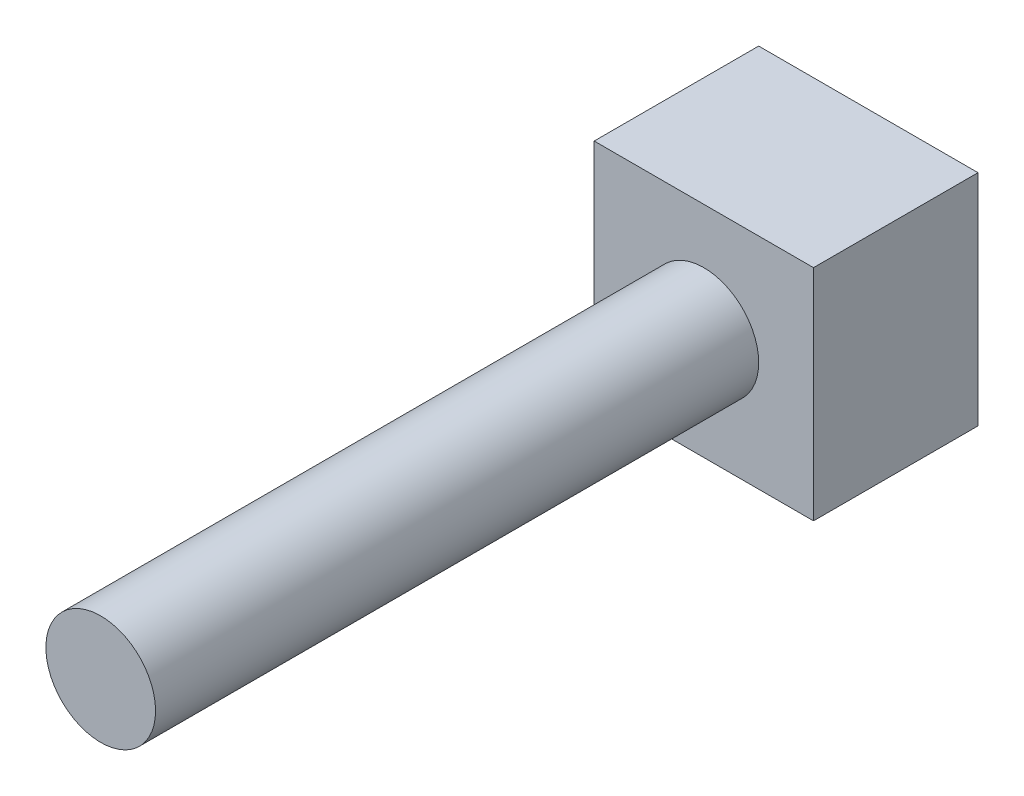
ISO-10303-21;
HEADER;
FILE_DESCRIPTION(('STEP AP214'),'2;1');
FILE_NAME('part.step','',(''),(''),'','','');
FILE_SCHEMA(('AUTOMOTIVE_DESIGN { 1 0 10303 214 1 1 1 1 }'));
ENDSEC;
DATA;
#1=APPLICATION_CONTEXT('core data for automotive mechanical design processes');
#2=APPLICATION_PROTOCOL_DEFINITION('international standard','automotive_design',2000,#1);
#3=PRODUCT_CONTEXT('',#1,'mechanical');
#4=PRODUCT('Part','Part','',(#3));
#5=PRODUCT_RELATED_PRODUCT_CATEGORY('part','',(#4));
#6=PRODUCT_DEFINITION_FORMATION('','',#4);
#7=PRODUCT_DEFINITION_CONTEXT('part definition',#1,'design');
#8=PRODUCT_DEFINITION('design','',#6,#7);
#9=PRODUCT_DEFINITION_SHAPE('','',#8);
#10=(LENGTH_UNIT() NAMED_UNIT(*) SI_UNIT(.MILLI.,.METRE.));
#11=(NAMED_UNIT(*) PLANE_ANGLE_UNIT() SI_UNIT($,.RADIAN.));
#12=(NAMED_UNIT(*) SI_UNIT($,.STERADIAN.) SOLID_ANGLE_UNIT());
#13=UNCERTAINTY_MEASURE_WITH_UNIT(LENGTH_MEASURE(1.E-05),#10,'distance_accuracy_value','');
#14=(GEOMETRIC_REPRESENTATION_CONTEXT(3) GLOBAL_UNCERTAINTY_ASSIGNED_CONTEXT((#13)) GLOBAL_UNIT_ASSIGNED_CONTEXT((#10,
#11,#12)) REPRESENTATION_CONTEXT('',''));
#15=CARTESIAN_POINT('',(0.,0.,0.));
#16=DIRECTION('',(0.,0.,1.));
#17=DIRECTION('',(1.,0.,0.));
#18=AXIS2_PLACEMENT_3D('',#15,#16,#17);
#19=CARTESIAN_POINT('',(1.,1.,1.5));
#20=DIRECTION('',(-1.,0.,0.));
#21=DIRECTION('',(0.,-1.,0.));
#22=AXIS2_PLACEMENT_3D('',#19,#20,#21);
#23=PLANE('',#22);
#24=DIRECTION('',(0.,1.,0.));
#25=VECTOR('',#24,1.);
#26=CARTESIAN_POINT('',(1.,1.,0.));
#27=LINE('',#26,#25);
#28=CARTESIAN_POINT('',(1.,-1.,0.));
#29=VERTEX_POINT('',#28);
#30=CARTESIAN_POINT('',(1.,1.,0.));
#31=VERTEX_POINT('',#30);
#32=EDGE_CURVE('E105',#29,#31,#27,.T.);
#33=ORIENTED_EDGE('',*,*,#32,.T.);
#34=DIRECTION('',(0.,0.,-1.));
#35=VECTOR('',#34,1.);
#36=CARTESIAN_POINT('',(1.,1.,1.5));
#37=LINE('',#36,#35);
#38=CARTESIAN_POINT('',(1.,1.,1.5));
#39=VERTEX_POINT('',#38);
#40=EDGE_CURVE('E42',#39,#31,#37,.T.);
#41=ORIENTED_EDGE('',*,*,#40,.F.);
#42=DIRECTION('',(0.,1.,0.));
#43=VECTOR('',#42,1.);
#44=CARTESIAN_POINT('',(1.,1.,1.5));
#45=LINE('',#44,#43);
#46=CARTESIAN_POINT('',(1.,-1.,1.5));
#47=VERTEX_POINT('',#46);
#48=EDGE_CURVE('E92',#47,#39,#45,.T.);
#49=ORIENTED_EDGE('',*,*,#48,.F.);
#50=DIRECTION('',(0.,0.,-1.));
#51=VECTOR('',#50,1.);
#52=CARTESIAN_POINT('',(1.,-1.,1.5));
#53=LINE('',#52,#51);
#54=EDGE_CURVE('E101',#47,#29,#53,.T.);
#55=ORIENTED_EDGE('',*,*,#54,.T.);
#56=EDGE_LOOP('',(#33,#41,#49,#55));
#57=FACE_BOUND('',#56,.T.);
#58=ADVANCED_FACE('F39',(#57),#23,.F.);
#59=CARTESIAN_POINT('',(-1.,1.,1.5));
#60=DIRECTION('',(0.,-1.,0.));
#61=DIRECTION('',(0.,0.,-1.));
#62=AXIS2_PLACEMENT_3D('',#59,#60,#61);
#63=PLANE('',#62);
#64=DIRECTION('',(-1.,0.,0.));
#65=VECTOR('',#64,1.);
#66=CARTESIAN_POINT('',(-1.,1.,0.));
#67=LINE('',#66,#65);
#68=CARTESIAN_POINT('',(-1.,1.,0.));
#69=VERTEX_POINT('',#68);
#70=EDGE_CURVE('E97',#31,#69,#67,.T.);
#71=ORIENTED_EDGE('',*,*,#70,.T.);
#72=DIRECTION('',(0.,0.,-1.));
#73=VECTOR('',#72,1.);
#74=CARTESIAN_POINT('',(-1.,1.,1.5));
#75=LINE('',#74,#73);
#76=CARTESIAN_POINT('',(-1.,1.,1.5));
#77=VERTEX_POINT('',#76);
#78=EDGE_CURVE('E95',#77,#69,#75,.T.);
#79=ORIENTED_EDGE('',*,*,#78,.F.);
#80=DIRECTION('',(-1.,0.,0.));
#81=VECTOR('',#80,1.);
#82=CARTESIAN_POINT('',(-1.,1.,1.5));
#83=LINE('',#82,#81);
#84=EDGE_CURVE('E87',#39,#77,#83,.T.);
#85=ORIENTED_EDGE('',*,*,#84,.F.);
#86=ORIENTED_EDGE('',*,*,#40,.T.);
#87=EDGE_LOOP('',(#71,#79,#85,#86));
#88=FACE_BOUND('',#87,.T.);
#89=ADVANCED_FACE('F96',(#88),#63,.F.);
#90=CARTESIAN_POINT('',(-1.,1.,1.5));
#91=DIRECTION('',(1.,0.,0.));
#92=DIRECTION('',(0.,1.,0.));
#93=AXIS2_PLACEMENT_3D('',#90,#91,#92);
#94=PLANE('',#93);
#95=DIRECTION('',(0.,-1.,0.));
#96=VECTOR('',#95,1.);
#97=CARTESIAN_POINT('',(-1.,1.,0.));
#98=LINE('',#97,#96);
#99=CARTESIAN_POINT('',(-1.,-1.,0.));
#100=VERTEX_POINT('',#99);
#101=EDGE_CURVE('E73',#69,#100,#98,.T.);
#102=ORIENTED_EDGE('',*,*,#101,.T.);
#103=DIRECTION('',(0.,0.,-1.));
#104=VECTOR('',#103,1.);
#105=CARTESIAN_POINT('',(-1.,-1.,1.5));
#106=LINE('',#105,#104);
#107=CARTESIAN_POINT('',(-1.,-1.,1.5));
#108=VERTEX_POINT('',#107);
#109=EDGE_CURVE('E98',#108,#100,#106,.T.);
#110=ORIENTED_EDGE('',*,*,#109,.F.);
#111=DIRECTION('',(0.,-1.,0.));
#112=VECTOR('',#111,1.);
#113=CARTESIAN_POINT('',(-1.,1.,1.5));
#114=LINE('',#113,#112);
#115=EDGE_CURVE('E90',#77,#108,#114,.T.);
#116=ORIENTED_EDGE('',*,*,#115,.F.);
#117=ORIENTED_EDGE('',*,*,#78,.T.);
#118=EDGE_LOOP('',(#102,#110,#116,#117));
#119=FACE_BOUND('',#118,.T.);
#120=ADVANCED_FACE('F99',(#119),#94,.F.);
#121=CARTESIAN_POINT('',(-1.,-1.,1.5));
#122=DIRECTION('',(0.,1.,0.));
#123=DIRECTION('',(0.,0.,1.));
#124=AXIS2_PLACEMENT_3D('',#121,#122,#123);
#125=PLANE('',#124);
#126=DIRECTION('',(1.,0.,0.));
#127=VECTOR('',#126,1.);
#128=CARTESIAN_POINT('',(-1.,-1.,0.));
#129=LINE('',#128,#127);
#130=EDGE_CURVE('E79',#100,#29,#129,.T.);
#131=ORIENTED_EDGE('',*,*,#130,.T.);
#132=ORIENTED_EDGE('',*,*,#54,.F.);
#133=DIRECTION('',(1.,0.,0.));
#134=VECTOR('',#133,1.);
#135=CARTESIAN_POINT('',(-1.,-1.,1.5));
#136=LINE('',#135,#134);
#137=EDGE_CURVE('E56',#108,#47,#136,.T.);
#138=ORIENTED_EDGE('',*,*,#137,.F.);
#139=ORIENTED_EDGE('',*,*,#109,.T.);
#140=EDGE_LOOP('',(#131,#132,#138,#139));
#141=FACE_BOUND('',#140,.T.);
#142=ADVANCED_FACE('F113',(#141),#125,.F.);
#143=CARTESIAN_POINT('',(0.,0.,1.5));
#144=DIRECTION('',(0.,0.,1.));
#145=DIRECTION('',(1.,0.,0.));
#146=AXIS2_PLACEMENT_3D('',#143,#144,#145);
#147=PLANE('',#146);
#148=CARTESIAN_POINT('',(0.,0.,1.5));
#149=DIRECTION('',(0.,0.,1.));
#150=DIRECTION('',(1.,0.,0.));
#151=AXIS2_PLACEMENT_3D('',#148,#149,#150);
#152=CIRCLE('',#151,0.5);
#153=CARTESIAN_POINT('',(0.5,0.,1.5));
#154=VERTEX_POINT('',#153);
#155=EDGE_CURVE('E11',#154,#154,#152,.T.);
#156=ORIENTED_EDGE('',*,*,#155,.F.);
#157=EDGE_LOOP('',(#156));
#158=FACE_BOUND('',#157,.T.);
#159=ORIENTED_EDGE('',*,*,#48,.T.);
#160=ORIENTED_EDGE('',*,*,#84,.T.);
#161=ORIENTED_EDGE('',*,*,#115,.T.);
#162=ORIENTED_EDGE('',*,*,#137,.T.);
#163=EDGE_LOOP('',(#159,#160,#161,#162));
#164=FACE_BOUND('',#163,.T.);
#165=ADVANCED_FACE('F88',(#158,#164),#147,.T.);
#166=CARTESIAN_POINT('',(0.,0.,0.));
#167=DIRECTION('',(0.,0.,1.));
#168=DIRECTION('',(1.,0.,0.));
#169=AXIS2_PLACEMENT_3D('',#166,#167,#168);
#170=PLANE('',#169);
#171=ORIENTED_EDGE('',*,*,#32,.F.);
#172=ORIENTED_EDGE('',*,*,#130,.F.);
#173=ORIENTED_EDGE('',*,*,#101,.F.);
#174=ORIENTED_EDGE('',*,*,#70,.F.);
#175=EDGE_LOOP('',(#171,#172,#173,#174));
#176=FACE_BOUND('',#175,.T.);
#177=ADVANCED_FACE('F116',(#176),#170,.F.);
#178=CARTESIAN_POINT('',(0.,0.,7.));
#179=DIRECTION('',(0.,0.,-1.));
#180=DIRECTION('',(-1.,0.,0.));
#181=AXIS2_PLACEMENT_3D('',#178,#179,#180);
#182=CYLINDRICAL_SURFACE('',#181,0.5);
#183=CARTESIAN_POINT('',(0.,0.,7.));
#184=DIRECTION('',(0.,0.,1.));
#185=DIRECTION('',(1.,0.,0.));
#186=AXIS2_PLACEMENT_3D('',#183,#184,#185);
#187=CIRCLE('',#186,0.5);
#188=CARTESIAN_POINT('',(0.5,0.,7.));
#189=VERTEX_POINT('',#188);
#190=EDGE_CURVE('E108',#189,#189,#187,.T.);
#191=ORIENTED_EDGE('',*,*,#190,.F.);
#192=EDGE_LOOP('',(#191));
#193=FACE_BOUND('',#192,.T.);
#194=ORIENTED_EDGE('',*,*,#155,.T.);
#195=EDGE_LOOP('',(#194));
#196=FACE_BOUND('',#195,.T.);
#197=ADVANCED_FACE('F124',(#193,#196),#182,.T.);
#198=CARTESIAN_POINT('',(0.,0.,7.));
#199=DIRECTION('',(0.,0.,1.));
#200=DIRECTION('',(1.,0.,0.));
#201=AXIS2_PLACEMENT_3D('',#198,#199,#200);
#202=PLANE('',#201);
#203=ORIENTED_EDGE('',*,*,#190,.T.);
#204=EDGE_LOOP('',(#203));
#205=FACE_BOUND('',#204,.T.);
#206=ADVANCED_FACE('F122',(#205),#202,.T.);
#207=CLOSED_SHELL('',(#58,#89,#120,#142,#165,#177,#197,#206));
#208=MANIFOLD_SOLID_BREP('B2',#207);
#209=ADVANCED_BREP_SHAPE_REPRESENTATION('',(#18,#208),#14);
#210=SHAPE_DEFINITION_REPRESENTATION(#9,#209);
ENDSEC;
END-ISO-10303-21;
